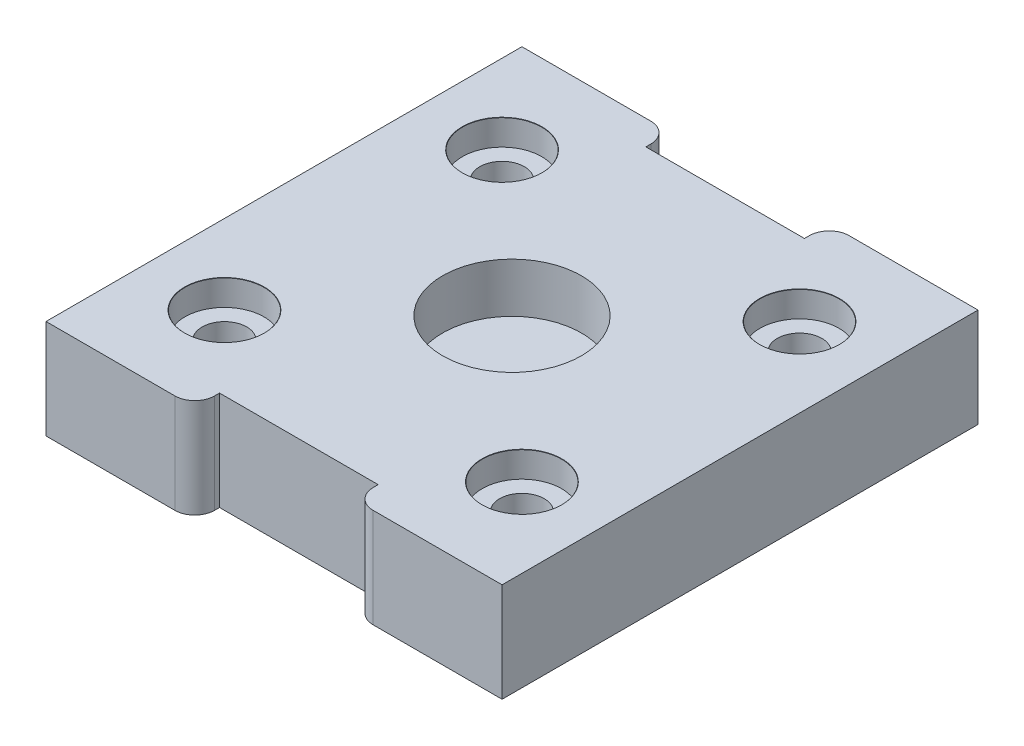
ISO-10303-21;
HEADER;
FILE_DESCRIPTION(('STEP AP214'),'2;1');
FILE_NAME('part.step','',(''),(''),'','','');
FILE_SCHEMA(('AUTOMOTIVE_DESIGN { 1 0 10303 214 1 1 1 1 }'));
ENDSEC;
DATA;
#1=APPLICATION_CONTEXT('core data for automotive mechanical design processes');
#2=APPLICATION_PROTOCOL_DEFINITION('international standard','automotive_design',2000,#1);
#3=PRODUCT_CONTEXT('',#1,'mechanical');
#4=PRODUCT('Part','Part','',(#3));
#5=PRODUCT_RELATED_PRODUCT_CATEGORY('part','',(#4));
#6=PRODUCT_DEFINITION_FORMATION('','',#4);
#7=PRODUCT_DEFINITION_CONTEXT('part definition',#1,'design');
#8=PRODUCT_DEFINITION('design','',#6,#7);
#9=PRODUCT_DEFINITION_SHAPE('','',#8);
#10=(LENGTH_UNIT() NAMED_UNIT(*) SI_UNIT(.MILLI.,.METRE.));
#11=(NAMED_UNIT(*) PLANE_ANGLE_UNIT() SI_UNIT($,.RADIAN.));
#12=(NAMED_UNIT(*) SI_UNIT($,.STERADIAN.) SOLID_ANGLE_UNIT());
#13=UNCERTAINTY_MEASURE_WITH_UNIT(LENGTH_MEASURE(1.E-05),#10,'distance_accuracy_value','');
#14=(GEOMETRIC_REPRESENTATION_CONTEXT(3) GLOBAL_UNCERTAINTY_ASSIGNED_CONTEXT((#13)) GLOBAL_UNIT_ASSIGNED_CONTEXT((#10,
#11,#12)) REPRESENTATION_CONTEXT('',''));
#15=CARTESIAN_POINT('',(0.,0.,0.));
#16=DIRECTION('',(0.,0.,1.));
#17=DIRECTION('',(1.,0.,0.));
#18=AXIS2_PLACEMENT_3D('',#15,#16,#17);
#19=CARTESIAN_POINT('',(0.,0.,48.));
#20=DIRECTION('',(0.,0.,1.));
#21=DIRECTION('',(1.,0.,0.));
#22=AXIS2_PLACEMENT_3D('',#19,#20,#21);
#23=PLANE('',#22);
#24=DIRECTION('',(1.,0.,0.));
#25=VECTOR('',#24,1.);
#26=CARTESIAN_POINT('',(-23.,-5.,48.));
#27=LINE('',#26,#25);
#28=CARTESIAN_POINT('',(-23.,-5.,48.));
#29=VERTEX_POINT('',#28);
#30=CARTESIAN_POINT('',(-10.,-5.,48.));
#31=VERTEX_POINT('',#30);
#32=EDGE_CURVE('E209',#29,#31,#27,.T.);
#33=ORIENTED_EDGE('',*,*,#32,.T.);
#34=DIRECTION('',(0.,-1.,0.));
#35=VECTOR('',#34,1.);
#36=CARTESIAN_POINT('',(-10.,5.,48.));
#37=LINE('',#36,#35);
#38=CARTESIAN_POINT('',(-10.,5.,48.));
#39=VERTEX_POINT('',#38);
#40=EDGE_CURVE('E257',#31,#39,#37,.F.);
#41=ORIENTED_EDGE('',*,*,#40,.T.);
#42=DIRECTION('',(-1.,0.,0.));
#43=VECTOR('',#42,1.);
#44=CARTESIAN_POINT('',(-23.,5.,48.));
#45=LINE('',#44,#43);
#46=CARTESIAN_POINT('',(-23.,5.,48.));
#47=VERTEX_POINT('',#46);
#48=EDGE_CURVE('E201',#39,#47,#45,.T.);
#49=ORIENTED_EDGE('',*,*,#48,.T.);
#50=DIRECTION('',(0.,-1.,0.));
#51=VECTOR('',#50,1.);
#52=CARTESIAN_POINT('',(-23.,5.,48.));
#53=LINE('',#52,#51);
#54=EDGE_CURVE('E206',#47,#29,#53,.T.);
#55=ORIENTED_EDGE('',*,*,#54,.T.);
#56=EDGE_LOOP('',(#33,#41,#49,#55));
#57=FACE_BOUND('',#56,.T.);
#58=ADVANCED_FACE('F33',(#57),#23,.T.);
#59=CARTESIAN_POINT('',(0.,0.,0.));
#60=DIRECTION('',(0.,0.,1.));
#61=DIRECTION('',(1.,0.,0.));
#62=AXIS2_PLACEMENT_3D('',#59,#60,#61);
#63=PLANE('',#62);
#64=DIRECTION('',(1.,0.,0.));
#65=VECTOR('',#64,1.);
#66=CARTESIAN_POINT('',(-23.,-5.,0.));
#67=LINE('',#66,#65);
#68=CARTESIAN_POINT('',(10.,-5.,0.));
#69=VERTEX_POINT('',#68);
#70=CARTESIAN_POINT('',(23.,-5.,0.));
#71=VERTEX_POINT('',#70);
#72=EDGE_CURVE('E221',#69,#71,#67,.T.);
#73=ORIENTED_EDGE('',*,*,#72,.F.);
#74=DIRECTION('',(0.,1.,0.));
#75=VECTOR('',#74,1.);
#76=CARTESIAN_POINT('',(10.,0.,0.));
#77=LINE('',#76,#75);
#78=CARTESIAN_POINT('',(10.,5.,0.));
#79=VERTEX_POINT('',#78);
#80=EDGE_CURVE('E259',#69,#79,#77,.T.);
#81=ORIENTED_EDGE('',*,*,#80,.T.);
#82=DIRECTION('',(-1.,0.,0.));
#83=VECTOR('',#82,1.);
#84=CARTESIAN_POINT('',(-23.,5.,0.));
#85=LINE('',#84,#83);
#86=CARTESIAN_POINT('',(23.,5.,0.));
#87=VERTEX_POINT('',#86);
#88=EDGE_CURVE('E216',#87,#79,#85,.T.);
#89=ORIENTED_EDGE('',*,*,#88,.F.);
#90=DIRECTION('',(0.,1.,0.));
#91=VECTOR('',#90,1.);
#92=CARTESIAN_POINT('',(23.,5.,0.));
#93=LINE('',#92,#91);
#94=EDGE_CURVE('E175',#71,#87,#93,.T.);
#95=ORIENTED_EDGE('',*,*,#94,.F.);
#96=EDGE_LOOP('',(#73,#81,#89,#95));
#97=FACE_BOUND('',#96,.T.);
#98=ADVANCED_FACE('F293',(#97),#63,.F.);
#99=CARTESIAN_POINT('',(23.,5.,48.));
#100=DIRECTION('',(-1.,0.,0.));
#101=DIRECTION('',(0.,0.,1.));
#102=AXIS2_PLACEMENT_3D('',#99,#100,#101);
#103=PLANE('',#102);
#104=ORIENTED_EDGE('',*,*,#94,.T.);
#105=DIRECTION('',(0.,0.,-1.));
#106=VECTOR('',#105,1.);
#107=CARTESIAN_POINT('',(23.,5.,48.));
#108=LINE('',#107,#106);
#109=CARTESIAN_POINT('',(23.,5.,48.));
#110=VERTEX_POINT('',#109);
#111=EDGE_CURVE('E231',#110,#87,#108,.T.);
#112=ORIENTED_EDGE('',*,*,#111,.F.);
#113=DIRECTION('',(0.,1.,0.));
#114=VECTOR('',#113,1.);
#115=CARTESIAN_POINT('',(23.,5.,48.));
#116=LINE('',#115,#114);
#117=CARTESIAN_POINT('',(23.,-5.,48.));
#118=VERTEX_POINT('',#117);
#119=EDGE_CURVE('E198',#118,#110,#116,.T.);
#120=ORIENTED_EDGE('',*,*,#119,.F.);
#121=DIRECTION('',(0.,0.,-1.));
#122=VECTOR('',#121,1.);
#123=CARTESIAN_POINT('',(23.,-5.,48.));
#124=LINE('',#123,#122);
#125=EDGE_CURVE('E212',#118,#71,#124,.T.);
#126=ORIENTED_EDGE('',*,*,#125,.T.);
#127=EDGE_LOOP('',(#104,#112,#120,#126));
#128=FACE_BOUND('',#127,.T.);
#129=ADVANCED_FACE('F300',(#128),#103,.F.);
#130=CARTESIAN_POINT('',(-23.,5.,48.));
#131=DIRECTION('',(0.,-1.,0.));
#132=DIRECTION('',(0.,0.,-1.));
#133=AXIS2_PLACEMENT_3D('',#130,#131,#132);
#134=PLANE('',#133);
#135=CARTESIAN_POINT('',(0.,5.,24.));
#136=DIRECTION('',(0.,1.,0.));
#137=DIRECTION('',(0.,0.,1.));
#138=AXIS2_PLACEMENT_3D('',#135,#136,#137);
#139=CIRCLE('',#138,7.);
#140=CARTESIAN_POINT('',(0.,5.,31.));
#141=VERTEX_POINT('',#140);
#142=EDGE_CURVE('E703',#141,#141,#139,.T.);
#143=ORIENTED_EDGE('',*,*,#142,.F.);
#144=EDGE_LOOP('',(#143));
#145=FACE_BOUND('',#144,.T.);
#146=CARTESIAN_POINT('',(-15.,5.,10.));
#147=DIRECTION('',(0.,1.,0.));
#148=DIRECTION('',(0.,0.,1.));
#149=AXIS2_PLACEMENT_3D('',#146,#147,#148);
#150=CIRCLE('',#149,4.025);
#151=CARTESIAN_POINT('',(-15.,5.,14.025));
#152=VERTEX_POINT('',#151);
#153=EDGE_CURVE('E699',#152,#152,#150,.T.);
#154=ORIENTED_EDGE('',*,*,#153,.F.);
#155=EDGE_LOOP('',(#154));
#156=FACE_BOUND('',#155,.T.);
#157=CARTESIAN_POINT('',(-15.,5.,38.));
#158=DIRECTION('',(0.,1.,0.));
#159=DIRECTION('',(0.,0.,1.));
#160=AXIS2_PLACEMENT_3D('',#157,#158,#159);
#161=CIRCLE('',#160,4.025);
#162=CARTESIAN_POINT('',(-15.,5.,42.025));
#163=VERTEX_POINT('',#162);
#164=EDGE_CURVE('E684',#163,#163,#161,.T.);
#165=ORIENTED_EDGE('',*,*,#164,.F.);
#166=EDGE_LOOP('',(#165));
#167=FACE_BOUND('',#166,.T.);
#168=CARTESIAN_POINT('',(15.,5.,38.));
#169=DIRECTION('',(0.,1.,0.));
#170=DIRECTION('',(0.,0.,1.));
#171=AXIS2_PLACEMENT_3D('',#168,#169,#170);
#172=CIRCLE('',#171,4.025);
#173=CARTESIAN_POINT('',(15.,5.,42.025));
#174=VERTEX_POINT('',#173);
#175=EDGE_CURVE('E669',#174,#174,#172,.T.);
#176=ORIENTED_EDGE('',*,*,#175,.F.);
#177=EDGE_LOOP('',(#176));
#178=FACE_BOUND('',#177,.T.);
#179=CARTESIAN_POINT('',(15.,5.,10.));
#180=DIRECTION('',(0.,1.,0.));
#181=DIRECTION('',(0.,0.,1.));
#182=AXIS2_PLACEMENT_3D('',#179,#180,#181);
#183=CIRCLE('',#182,4.025);
#184=CARTESIAN_POINT('',(15.,5.,14.025));
#185=VERTEX_POINT('',#184);
#186=EDGE_CURVE('E654',#185,#185,#183,.T.);
#187=ORIENTED_EDGE('',*,*,#186,.F.);
#188=EDGE_LOOP('',(#187));
#189=FACE_BOUND('',#188,.T.);
#190=DIRECTION('',(0.,0.,-1.));
#191=VECTOR('',#190,1.);
#192=CARTESIAN_POINT('',(7.99999999999998,5.,50.5));
#193=LINE('',#192,#191);
#194=CARTESIAN_POINT('',(7.99999999999998,5.,46.));
#195=VERTEX_POINT('',#194);
#196=CARTESIAN_POINT('',(7.99999999999998,5.,45.5));
#197=VERTEX_POINT('',#196);
#198=EDGE_CURVE('E190',#195,#197,#193,.T.);
#199=ORIENTED_EDGE('',*,*,#198,.F.);
#200=CARTESIAN_POINT('',(9.99999999999998,5.,46.));
#201=DIRECTION('',(0.,-1.,0.));
#202=DIRECTION('',(0.,0.,-1.));
#203=AXIS2_PLACEMENT_3D('',#200,#201,#202);
#204=CIRCLE('',#203,2.);
#205=CARTESIAN_POINT('',(9.99999999999998,5.,48.));
#206=VERTEX_POINT('',#205);
#207=EDGE_CURVE('E243',#195,#206,#204,.F.);
#208=ORIENTED_EDGE('',*,*,#207,.T.);
#209=EDGE_CURVE('E203',#110,#206,#45,.T.);
#210=ORIENTED_EDGE('',*,*,#209,.F.);
#211=ORIENTED_EDGE('',*,*,#111,.T.);
#212=ORIENTED_EDGE('',*,*,#88,.T.);
#213=CARTESIAN_POINT('',(10.,5.,2.));
#214=DIRECTION('',(0.,-1.,0.));
#215=DIRECTION('',(0.,0.,-1.));
#216=AXIS2_PLACEMENT_3D('',#213,#214,#215);
#217=CIRCLE('',#216,2.);
#218=CARTESIAN_POINT('',(8.,5.,2.));
#219=VERTEX_POINT('',#218);
#220=EDGE_CURVE('E239',#79,#219,#217,.F.);
#221=ORIENTED_EDGE('',*,*,#220,.T.);
#222=DIRECTION('',(0.,0.,-1.));
#223=VECTOR('',#222,1.);
#224=CARTESIAN_POINT('',(8.,5.,-2.5));
#225=LINE('',#224,#223);
#226=CARTESIAN_POINT('',(8.,5.,2.5));
#227=VERTEX_POINT('',#226);
#228=EDGE_CURVE('E168',#227,#219,#225,.T.);
#229=ORIENTED_EDGE('',*,*,#228,.F.);
#230=DIRECTION('',(1.,0.,0.));
#231=VECTOR('',#230,1.);
#232=CARTESIAN_POINT('',(-8.,5.,2.5));
#233=LINE('',#232,#231);
#234=CARTESIAN_POINT('',(-8.,5.,2.5));
#235=VERTEX_POINT('',#234);
#236=EDGE_CURVE('E173',#235,#227,#233,.T.);
#237=ORIENTED_EDGE('',*,*,#236,.F.);
#238=DIRECTION('',(0.,0.,1.));
#239=VECTOR('',#238,1.);
#240=CARTESIAN_POINT('',(-8.,5.,-2.5));
#241=LINE('',#240,#239);
#242=CARTESIAN_POINT('',(-8.,5.,2.));
#243=VERTEX_POINT('',#242);
#244=EDGE_CURVE('E157',#243,#235,#241,.T.);
#245=ORIENTED_EDGE('',*,*,#244,.F.);
#246=CARTESIAN_POINT('',(-10.,5.,2.));
#247=DIRECTION('',(0.,-1.,0.));
#248=DIRECTION('',(0.,0.,-1.));
#249=AXIS2_PLACEMENT_3D('',#246,#247,#248);
#250=CIRCLE('',#249,2.);
#251=CARTESIAN_POINT('',(-10.,5.,0.));
#252=VERTEX_POINT('',#251);
#253=EDGE_CURVE('E237',#243,#252,#250,.F.);
#254=ORIENTED_EDGE('',*,*,#253,.T.);
#255=CARTESIAN_POINT('',(-23.,5.,0.));
#256=VERTEX_POINT('',#255);
#257=EDGE_CURVE('E215',#252,#256,#85,.T.);
#258=ORIENTED_EDGE('',*,*,#257,.T.);
#259=DIRECTION('',(0.,0.,-1.));
#260=VECTOR('',#259,1.);
#261=CARTESIAN_POINT('',(-23.,5.,48.));
#262=LINE('',#261,#260);
#263=EDGE_CURVE('E228',#47,#256,#262,.T.);
#264=ORIENTED_EDGE('',*,*,#263,.F.);
#265=ORIENTED_EDGE('',*,*,#48,.F.);
#266=CARTESIAN_POINT('',(-10.,5.,46.));
#267=DIRECTION('',(0.,-1.,0.));
#268=DIRECTION('',(0.,0.,-1.));
#269=AXIS2_PLACEMENT_3D('',#266,#267,#268);
#270=CIRCLE('',#269,2.);
#271=CARTESIAN_POINT('',(-8.00000000000001,5.,46.));
#272=VERTEX_POINT('',#271);
#273=EDGE_CURVE('E241',#39,#272,#270,.F.);
#274=ORIENTED_EDGE('',*,*,#273,.T.);
#275=DIRECTION('',(0.,0.,1.));
#276=VECTOR('',#275,1.);
#277=CARTESIAN_POINT('',(-8.00000000000001,5.,50.5));
#278=LINE('',#277,#276);
#279=CARTESIAN_POINT('',(-8.00000000000001,5.,45.5));
#280=VERTEX_POINT('',#279);
#281=EDGE_CURVE('E187',#280,#272,#278,.T.);
#282=ORIENTED_EDGE('',*,*,#281,.F.);
#283=DIRECTION('',(-1.,0.,0.));
#284=VECTOR('',#283,1.);
#285=CARTESIAN_POINT('',(-8.00000000000001,5.,45.5));
#286=LINE('',#285,#284);
#287=EDGE_CURVE('E181',#197,#280,#286,.T.);
#288=ORIENTED_EDGE('',*,*,#287,.F.);
#289=EDGE_LOOP('',(#199,#208,#210,#211,#212,#221,#229,#237,#245,#254,#258,#264,#265,#274,#282,#288));
#290=FACE_BOUND('',#289,.T.);
#291=ADVANCED_FACE('F278',(#145,#156,#167,#178,#189,#290),#134,.F.);
#292=CARTESIAN_POINT('',(-23.,5.,48.));
#293=DIRECTION('',(1.,0.,0.));
#294=DIRECTION('',(0.,0.,-1.));
#295=AXIS2_PLACEMENT_3D('',#292,#293,#294);
#296=PLANE('',#295);
#297=DIRECTION('',(0.,-1.,0.));
#298=VECTOR('',#297,1.);
#299=CARTESIAN_POINT('',(-23.,5.,0.));
#300=LINE('',#299,#298);
#301=CARTESIAN_POINT('',(-23.,-5.,0.));
#302=VERTEX_POINT('',#301);
#303=EDGE_CURVE('E219',#256,#302,#300,.T.);
#304=ORIENTED_EDGE('',*,*,#303,.T.);
#305=DIRECTION('',(0.,0.,-1.));
#306=VECTOR('',#305,1.);
#307=CARTESIAN_POINT('',(-23.,-5.,48.));
#308=LINE('',#307,#306);
#309=EDGE_CURVE('E225',#29,#302,#308,.T.);
#310=ORIENTED_EDGE('',*,*,#309,.F.);
#311=ORIENTED_EDGE('',*,*,#54,.F.);
#312=ORIENTED_EDGE('',*,*,#263,.T.);
#313=EDGE_LOOP('',(#304,#310,#311,#312));
#314=FACE_BOUND('',#313,.T.);
#315=ADVANCED_FACE('F273',(#314),#296,.F.);
#316=CARTESIAN_POINT('',(-23.,-5.,48.));
#317=DIRECTION('',(0.,1.,0.));
#318=DIRECTION('',(0.,0.,1.));
#319=AXIS2_PLACEMENT_3D('',#316,#317,#318);
#320=PLANE('',#319);
#321=CARTESIAN_POINT('',(-15.,-5.,10.));
#322=DIRECTION('',(0.,1.,0.));
#323=DIRECTION('',(0.,0.,1.));
#324=AXIS2_PLACEMENT_3D('',#321,#322,#323);
#325=CIRCLE('',#324,2.25);
#326=CARTESIAN_POINT('',(-15.,-5.,12.25));
#327=VERTEX_POINT('',#326);
#328=EDGE_CURVE('E687',#327,#327,#325,.T.);
#329=ORIENTED_EDGE('',*,*,#328,.T.);
#330=EDGE_LOOP('',(#329));
#331=FACE_BOUND('',#330,.T.);
#332=CARTESIAN_POINT('',(-15.,-5.,38.));
#333=DIRECTION('',(0.,1.,0.));
#334=DIRECTION('',(0.,0.,1.));
#335=AXIS2_PLACEMENT_3D('',#332,#333,#334);
#336=CIRCLE('',#335,2.25);
#337=CARTESIAN_POINT('',(-15.,-5.,40.25));
#338=VERTEX_POINT('',#337);
#339=EDGE_CURVE('E672',#338,#338,#336,.T.);
#340=ORIENTED_EDGE('',*,*,#339,.T.);
#341=EDGE_LOOP('',(#340));
#342=FACE_BOUND('',#341,.T.);
#343=CARTESIAN_POINT('',(15.,-5.,38.));
#344=DIRECTION('',(0.,1.,0.));
#345=DIRECTION('',(0.,0.,1.));
#346=AXIS2_PLACEMENT_3D('',#343,#344,#345);
#347=CIRCLE('',#346,2.25);
#348=CARTESIAN_POINT('',(15.,-5.,40.25));
#349=VERTEX_POINT('',#348);
#350=EDGE_CURVE('E657',#349,#349,#347,.T.);
#351=ORIENTED_EDGE('',*,*,#350,.T.);
#352=EDGE_LOOP('',(#351));
#353=FACE_BOUND('',#352,.T.);
#354=CARTESIAN_POINT('',(15.,-5.,10.));
#355=DIRECTION('',(0.,1.,0.));
#356=DIRECTION('',(0.,0.,1.));
#357=AXIS2_PLACEMENT_3D('',#354,#355,#356);
#358=CIRCLE('',#357,2.25);
#359=CARTESIAN_POINT('',(15.,-5.,12.25));
#360=VERTEX_POINT('',#359);
#361=EDGE_CURVE('E191',#360,#360,#358,.T.);
#362=ORIENTED_EDGE('',*,*,#361,.T.);
#363=EDGE_LOOP('',(#362));
#364=FACE_BOUND('',#363,.T.);
#365=CARTESIAN_POINT('',(9.99999999999998,-5.,48.));
#366=VERTEX_POINT('',#365);
#367=EDGE_CURVE('E208',#366,#118,#27,.T.);
#368=ORIENTED_EDGE('',*,*,#367,.F.);
#369=CARTESIAN_POINT('',(9.99999999999998,-5.,46.));
#370=DIRECTION('',(0.,1.,0.));
#371=DIRECTION('',(0.,0.,1.));
#372=AXIS2_PLACEMENT_3D('',#369,#370,#371);
#373=CIRCLE('',#372,2.);
#374=CARTESIAN_POINT('',(7.99999999999998,-5.,46.));
#375=VERTEX_POINT('',#374);
#376=EDGE_CURVE('E252',#366,#375,#373,.F.);
#377=ORIENTED_EDGE('',*,*,#376,.T.);
#378=DIRECTION('',(0.,0.,-1.));
#379=VECTOR('',#378,1.);
#380=CARTESIAN_POINT('',(7.99999999999998,-5.,50.5));
#381=LINE('',#380,#379);
#382=CARTESIAN_POINT('',(7.99999999999998,-5.,45.5));
#383=VERTEX_POINT('',#382);
#384=EDGE_CURVE('E180',#375,#383,#381,.T.);
#385=ORIENTED_EDGE('',*,*,#384,.T.);
#386=DIRECTION('',(-1.,0.,0.));
#387=VECTOR('',#386,1.);
#388=CARTESIAN_POINT('',(-8.00000000000001,-5.,45.5));
#389=LINE('',#388,#387);
#390=CARTESIAN_POINT('',(-8.00000000000001,-5.,45.5));
#391=VERTEX_POINT('',#390);
#392=EDGE_CURVE('E183',#383,#391,#389,.T.);
#393=ORIENTED_EDGE('',*,*,#392,.T.);
#394=DIRECTION('',(0.,0.,1.));
#395=VECTOR('',#394,1.);
#396=CARTESIAN_POINT('',(-8.00000000000001,-5.,50.5));
#397=LINE('',#396,#395);
#398=CARTESIAN_POINT('',(-8.00000000000001,-5.,46.));
#399=VERTEX_POINT('',#398);
#400=EDGE_CURVE('E177',#391,#399,#397,.T.);
#401=ORIENTED_EDGE('',*,*,#400,.T.);
#402=CARTESIAN_POINT('',(-10.,-5.,46.));
#403=DIRECTION('',(0.,1.,0.));
#404=DIRECTION('',(0.,0.,1.));
#405=AXIS2_PLACEMENT_3D('',#402,#403,#404);
#406=CIRCLE('',#405,2.);
#407=EDGE_CURVE('E250',#399,#31,#406,.F.);
#408=ORIENTED_EDGE('',*,*,#407,.T.);
#409=ORIENTED_EDGE('',*,*,#32,.F.);
#410=ORIENTED_EDGE('',*,*,#309,.T.);
#411=CARTESIAN_POINT('',(-10.,-5.,0.));
#412=VERTEX_POINT('',#411);
#413=EDGE_CURVE('E202',#302,#412,#67,.T.);
#414=ORIENTED_EDGE('',*,*,#413,.T.);
#415=CARTESIAN_POINT('',(-10.,-5.,2.));
#416=DIRECTION('',(0.,1.,0.));
#417=DIRECTION('',(0.,0.,1.));
#418=AXIS2_PLACEMENT_3D('',#415,#416,#417);
#419=CIRCLE('',#418,2.);
#420=CARTESIAN_POINT('',(-8.,-5.,2.));
#421=VERTEX_POINT('',#420);
#422=EDGE_CURVE('E48',#412,#421,#419,.F.);
#423=ORIENTED_EDGE('',*,*,#422,.T.);
#424=DIRECTION('',(0.,0.,1.));
#425=VECTOR('',#424,1.);
#426=CARTESIAN_POINT('',(-8.,-5.,-2.5));
#427=LINE('',#426,#425);
#428=CARTESIAN_POINT('',(-8.,-5.,2.5));
#429=VERTEX_POINT('',#428);
#430=EDGE_CURVE('E143',#421,#429,#427,.T.);
#431=ORIENTED_EDGE('',*,*,#430,.T.);
#432=DIRECTION('',(1.,0.,0.));
#433=VECTOR('',#432,1.);
#434=CARTESIAN_POINT('',(-8.,-5.,2.5));
#435=LINE('',#434,#433);
#436=CARTESIAN_POINT('',(8.,-5.,2.5));
#437=VERTEX_POINT('',#436);
#438=EDGE_CURVE('E149',#429,#437,#435,.T.);
#439=ORIENTED_EDGE('',*,*,#438,.T.);
#440=DIRECTION('',(0.,0.,-1.));
#441=VECTOR('',#440,1.);
#442=CARTESIAN_POINT('',(8.,-5.,-2.5));
#443=LINE('',#442,#441);
#444=CARTESIAN_POINT('',(8.,-5.,2.));
#445=VERTEX_POINT('',#444);
#446=EDGE_CURVE('E151',#437,#445,#443,.T.);
#447=ORIENTED_EDGE('',*,*,#446,.T.);
#448=CARTESIAN_POINT('',(10.,-5.,2.));
#449=DIRECTION('',(0.,1.,0.));
#450=DIRECTION('',(0.,0.,1.));
#451=AXIS2_PLACEMENT_3D('',#448,#449,#450);
#452=CIRCLE('',#451,2.);
#453=EDGE_CURVE('E248',#445,#69,#452,.F.);
#454=ORIENTED_EDGE('',*,*,#453,.T.);
#455=ORIENTED_EDGE('',*,*,#72,.T.);
#456=ORIENTED_EDGE('',*,*,#125,.F.);
#457=EDGE_LOOP('',(#368,#377,#385,#393,#401,#408,#409,#410,#414,#423,#431,#439,#447,#454,#455,#456));
#458=FACE_BOUND('',#457,.T.);
#459=ADVANCED_FACE('F146',(#331,#342,#353,#364,#458),#320,.F.);
#460=ORIENTED_EDGE('',*,*,#209,.T.);
#461=DIRECTION('',(0.,1.,0.));
#462=VECTOR('',#461,1.);
#463=CARTESIAN_POINT('',(9.99999999999998,-5.,48.));
#464=LINE('',#463,#462);
#465=EDGE_CURVE('E245',#206,#366,#464,.F.);
#466=ORIENTED_EDGE('',*,*,#465,.T.);
#467=ORIENTED_EDGE('',*,*,#367,.T.);
#468=ORIENTED_EDGE('',*,*,#119,.T.);
#469=EDGE_LOOP('',(#460,#466,#467,#468));
#470=FACE_BOUND('',#469,.T.);
#471=ADVANCED_FACE('F296',(#470),#23,.T.);
#472=ORIENTED_EDGE('',*,*,#257,.F.);
#473=DIRECTION('',(0.,-1.,0.));
#474=VECTOR('',#473,1.);
#475=CARTESIAN_POINT('',(-10.,0.,0.));
#476=LINE('',#475,#474);
#477=EDGE_CURVE('E41',#252,#412,#476,.T.);
#478=ORIENTED_EDGE('',*,*,#477,.T.);
#479=ORIENTED_EDGE('',*,*,#413,.F.);
#480=ORIENTED_EDGE('',*,*,#303,.F.);
#481=EDGE_LOOP('',(#472,#478,#479,#480));
#482=FACE_BOUND('',#481,.T.);
#483=ADVANCED_FACE('F266',(#482),#63,.F.);
#484=CARTESIAN_POINT('',(8.,-5.,-2.5));
#485=DIRECTION('',(1.,0.,0.));
#486=DIRECTION('',(0.,0.,-1.));
#487=AXIS2_PLACEMENT_3D('',#484,#485,#486);
#488=PLANE('',#487);
#489=ORIENTED_EDGE('',*,*,#228,.T.);
#490=DIRECTION('',(0.,1.,0.));
#491=VECTOR('',#490,1.);
#492=CARTESIAN_POINT('',(8.,-5.,2.));
#493=LINE('',#492,#491);
#494=EDGE_CURVE('E262',#219,#445,#493,.F.);
#495=ORIENTED_EDGE('',*,*,#494,.T.);
#496=ORIENTED_EDGE('',*,*,#446,.F.);
#497=DIRECTION('',(0.,1.,0.));
#498=VECTOR('',#497,1.);
#499=CARTESIAN_POINT('',(8.,-5.,2.5));
#500=LINE('',#499,#498);
#501=EDGE_CURVE('E161',#437,#227,#500,.T.);
#502=ORIENTED_EDGE('',*,*,#501,.T.);
#503=EDGE_LOOP('',(#489,#495,#496,#502));
#504=FACE_BOUND('',#503,.T.);
#505=ADVANCED_FACE('F310',(#504),#488,.F.);
#506=CARTESIAN_POINT('',(-8.,-5.,-2.5));
#507=DIRECTION('',(-1.,0.,0.));
#508=DIRECTION('',(0.,0.,1.));
#509=AXIS2_PLACEMENT_3D('',#506,#507,#508);
#510=PLANE('',#509);
#511=ORIENTED_EDGE('',*,*,#430,.F.);
#512=DIRECTION('',(0.,-1.,0.));
#513=VECTOR('',#512,1.);
#514=CARTESIAN_POINT('',(-8.,-5.,2.));
#515=LINE('',#514,#513);
#516=EDGE_CURVE('E11',#421,#243,#515,.F.);
#517=ORIENTED_EDGE('',*,*,#516,.T.);
#518=ORIENTED_EDGE('',*,*,#244,.T.);
#519=DIRECTION('',(0.,1.,0.));
#520=VECTOR('',#519,1.);
#521=CARTESIAN_POINT('',(-8.,-5.,2.5));
#522=LINE('',#521,#520);
#523=EDGE_CURVE('E154',#429,#235,#522,.T.);
#524=ORIENTED_EDGE('',*,*,#523,.F.);
#525=EDGE_LOOP('',(#511,#517,#518,#524));
#526=FACE_BOUND('',#525,.T.);
#527=ADVANCED_FACE('F155',(#526),#510,.F.);
#528=CARTESIAN_POINT('',(-8.,-5.,2.5));
#529=DIRECTION('',(0.,0.,1.));
#530=DIRECTION('',(1.,0.,0.));
#531=AXIS2_PLACEMENT_3D('',#528,#529,#530);
#532=PLANE('',#531);
#533=ORIENTED_EDGE('',*,*,#236,.T.);
#534=ORIENTED_EDGE('',*,*,#501,.F.);
#535=ORIENTED_EDGE('',*,*,#438,.F.);
#536=ORIENTED_EDGE('',*,*,#523,.T.);
#537=EDGE_LOOP('',(#533,#534,#535,#536));
#538=FACE_BOUND('',#537,.T.);
#539=ADVANCED_FACE('F163',(#538),#532,.F.);
#540=CARTESIAN_POINT('',(-8.00000000000001,-5.,50.5));
#541=DIRECTION('',(-1.,0.,0.));
#542=DIRECTION('',(0.,0.,1.));
#543=AXIS2_PLACEMENT_3D('',#540,#541,#542);
#544=PLANE('',#543);
#545=ORIENTED_EDGE('',*,*,#281,.T.);
#546=DIRECTION('',(0.,-1.,0.));
#547=VECTOR('',#546,1.);
#548=CARTESIAN_POINT('',(-8.00000000000001,-5.,46.));
#549=LINE('',#548,#547);
#550=EDGE_CURVE('E254',#272,#399,#549,.T.);
#551=ORIENTED_EDGE('',*,*,#550,.T.);
#552=ORIENTED_EDGE('',*,*,#400,.F.);
#553=DIRECTION('',(0.,1.,0.));
#554=VECTOR('',#553,1.);
#555=CARTESIAN_POINT('',(-8.00000000000001,-5.,45.5));
#556=LINE('',#555,#554);
#557=EDGE_CURVE('E171',#391,#280,#556,.T.);
#558=ORIENTED_EDGE('',*,*,#557,.T.);
#559=EDGE_LOOP('',(#545,#551,#552,#558));
#560=FACE_BOUND('',#559,.T.);
#561=ADVANCED_FACE('F331',(#560),#544,.F.);
#562=CARTESIAN_POINT('',(-8.00000000000001,-5.,45.5));
#563=DIRECTION('',(0.,0.,-1.));
#564=DIRECTION('',(-1.,0.,0.));
#565=AXIS2_PLACEMENT_3D('',#562,#563,#564);
#566=PLANE('',#565);
#567=ORIENTED_EDGE('',*,*,#287,.T.);
#568=ORIENTED_EDGE('',*,*,#557,.F.);
#569=ORIENTED_EDGE('',*,*,#392,.F.);
#570=DIRECTION('',(0.,1.,0.));
#571=VECTOR('',#570,1.);
#572=CARTESIAN_POINT('',(7.99999999999998,-5.,45.5));
#573=LINE('',#572,#571);
#574=EDGE_CURVE('E186',#383,#197,#573,.T.);
#575=ORIENTED_EDGE('',*,*,#574,.T.);
#576=EDGE_LOOP('',(#567,#568,#569,#575));
#577=FACE_BOUND('',#576,.T.);
#578=ADVANCED_FACE('F328',(#577),#566,.F.);
#579=CARTESIAN_POINT('',(7.99999999999998,-5.,50.5));
#580=DIRECTION('',(1.,0.,0.));
#581=DIRECTION('',(0.,0.,-1.));
#582=AXIS2_PLACEMENT_3D('',#579,#580,#581);
#583=PLANE('',#582);
#584=ORIENTED_EDGE('',*,*,#384,.F.);
#585=DIRECTION('',(0.,1.,0.));
#586=VECTOR('',#585,1.);
#587=CARTESIAN_POINT('',(7.99999999999998,5.,46.));
#588=LINE('',#587,#586);
#589=EDGE_CURVE('E234',#375,#195,#588,.T.);
#590=ORIENTED_EDGE('',*,*,#589,.T.);
#591=ORIENTED_EDGE('',*,*,#198,.T.);
#592=ORIENTED_EDGE('',*,*,#574,.F.);
#593=EDGE_LOOP('',(#584,#590,#591,#592));
#594=FACE_BOUND('',#593,.T.);
#595=ADVANCED_FACE('F324',(#594),#583,.F.);
#596=CARTESIAN_POINT('',(9.99999999999998,-5.,46.));
#597=DIRECTION('',(0.,-1.,0.));
#598=DIRECTION('',(0.,0.,-1.));
#599=AXIS2_PLACEMENT_3D('',#596,#597,#598);
#600=CYLINDRICAL_SURFACE('',#599,2.);
#601=ORIENTED_EDGE('',*,*,#376,.F.);
#602=ORIENTED_EDGE('',*,*,#465,.F.);
#603=ORIENTED_EDGE('',*,*,#207,.F.);
#604=ORIENTED_EDGE('',*,*,#589,.F.);
#605=EDGE_LOOP('',(#601,#602,#603,#604));
#606=FACE_BOUND('',#605,.T.);
#607=ADVANCED_FACE('F318',(#606),#600,.T.);
#608=CARTESIAN_POINT('',(-10.,-5.,46.));
#609=DIRECTION('',(0.,1.,0.));
#610=DIRECTION('',(0.,0.,1.));
#611=AXIS2_PLACEMENT_3D('',#608,#609,#610);
#612=CYLINDRICAL_SURFACE('',#611,2.);
#613=ORIENTED_EDGE('',*,*,#273,.F.);
#614=ORIENTED_EDGE('',*,*,#40,.F.);
#615=ORIENTED_EDGE('',*,*,#407,.F.);
#616=ORIENTED_EDGE('',*,*,#550,.F.);
#617=EDGE_LOOP('',(#613,#614,#615,#616));
#618=FACE_BOUND('',#617,.T.);
#619=ADVANCED_FACE('F290',(#618),#612,.T.);
#620=CARTESIAN_POINT('',(10.,0.,2.));
#621=DIRECTION('',(0.,1.,0.));
#622=DIRECTION('',(0.,0.,1.));
#623=AXIS2_PLACEMENT_3D('',#620,#621,#622);
#624=CYLINDRICAL_SURFACE('',#623,2.);
#625=ORIENTED_EDGE('',*,*,#453,.F.);
#626=ORIENTED_EDGE('',*,*,#494,.F.);
#627=ORIENTED_EDGE('',*,*,#220,.F.);
#628=ORIENTED_EDGE('',*,*,#80,.F.);
#629=EDGE_LOOP('',(#625,#626,#627,#628));
#630=FACE_BOUND('',#629,.T.);
#631=ADVANCED_FACE('F282',(#630),#624,.T.);
#632=CARTESIAN_POINT('',(-10.,0.,2.));
#633=DIRECTION('',(0.,-1.,0.));
#634=DIRECTION('',(0.,0.,-1.));
#635=AXIS2_PLACEMENT_3D('',#632,#633,#634);
#636=CYLINDRICAL_SURFACE('',#635,2.);
#637=ORIENTED_EDGE('',*,*,#253,.F.);
#638=ORIENTED_EDGE('',*,*,#516,.F.);
#639=ORIENTED_EDGE('',*,*,#422,.F.);
#640=ORIENTED_EDGE('',*,*,#477,.F.);
#641=EDGE_LOOP('',(#637,#638,#639,#640));
#642=FACE_BOUND('',#641,.T.);
#643=ADVANCED_FACE('F35',(#642),#636,.T.);
#644=CARTESIAN_POINT('',(15.,5.,10.));
#645=DIRECTION('',(0.,1.,0.));
#646=DIRECTION('',(0.,0.,1.));
#647=AXIS2_PLACEMENT_3D('',#644,#645,#646);
#648=CYLINDRICAL_SURFACE('',#647,2.25);
#649=ORIENTED_EDGE('',*,*,#361,.F.);
#650=EDGE_LOOP('',(#649));
#651=FACE_BOUND('',#650,.T.);
#652=CARTESIAN_POINT('',(15.,2.4,10.));
#653=DIRECTION('',(0.,1.,0.));
#654=DIRECTION('',(0.,0.,1.));
#655=AXIS2_PLACEMENT_3D('',#652,#653,#654);
#656=CIRCLE('',#655,2.25);
#657=CARTESIAN_POINT('',(15.,2.4,12.25));
#658=VERTEX_POINT('',#657);
#659=EDGE_CURVE('E645',#658,#658,#656,.T.);
#660=ORIENTED_EDGE('',*,*,#659,.T.);
#661=EDGE_LOOP('',(#660));
#662=FACE_BOUND('',#661,.T.);
#663=ADVANCED_FACE('F281',(#651,#662),#648,.F.);
#664=CARTESIAN_POINT('',(17.25,2.4,10.));
#665=DIRECTION('',(0.,-1.,0.));
#666=DIRECTION('',(0.,0.,-1.));
#667=AXIS2_PLACEMENT_3D('',#664,#665,#666);
#668=PLANE('',#667);
#669=ORIENTED_EDGE('',*,*,#659,.F.);
#670=EDGE_LOOP('',(#669));
#671=FACE_BOUND('',#670,.T.);
#672=CARTESIAN_POINT('',(15.,2.4,10.));
#673=DIRECTION('',(0.,1.,0.));
#674=DIRECTION('',(0.,0.,1.));
#675=AXIS2_PLACEMENT_3D('',#672,#673,#674);
#676=CIRCLE('',#675,4.);
#677=CARTESIAN_POINT('',(15.,2.4,14.));
#678=VERTEX_POINT('',#677);
#679=EDGE_CURVE('E648',#678,#678,#676,.T.);
#680=ORIENTED_EDGE('',*,*,#679,.T.);
#681=EDGE_LOOP('',(#680));
#682=FACE_BOUND('',#681,.T.);
#683=ADVANCED_FACE('F287',(#671,#682),#668,.F.);
#684=CARTESIAN_POINT('',(15.,5.,10.));
#685=DIRECTION('',(0.,1.,0.));
#686=DIRECTION('',(0.,0.,1.));
#687=AXIS2_PLACEMENT_3D('',#684,#685,#686);
#688=CYLINDRICAL_SURFACE('',#687,4.);
#689=ORIENTED_EDGE('',*,*,#679,.F.);
#690=EDGE_LOOP('',(#689));
#691=FACE_BOUND('',#690,.T.);
#692=CARTESIAN_POINT('',(15.,4.975,10.));
#693=DIRECTION('',(0.,1.,0.));
#694=DIRECTION('',(0.,0.,1.));
#695=AXIS2_PLACEMENT_3D('',#692,#693,#694);
#696=CIRCLE('',#695,4.);
#697=CARTESIAN_POINT('',(15.,4.975,14.));
#698=VERTEX_POINT('',#697);
#699=EDGE_CURVE('E651',#698,#698,#696,.T.);
#700=ORIENTED_EDGE('',*,*,#699,.T.);
#701=EDGE_LOOP('',(#700));
#702=FACE_BOUND('',#701,.T.);
#703=ADVANCED_FACE('F379',(#691,#702),#688,.F.);
#704=CARTESIAN_POINT('',(15.,5.,10.));
#705=DIRECTION('',(0.,1.,0.));
#706=DIRECTION('',(0.,0.,1.));
#707=AXIS2_PLACEMENT_3D('',#704,#705,#706);
#708=CONICAL_SURFACE('',#707,4.025,0.785398163397466);
#709=ORIENTED_EDGE('',*,*,#699,.F.);
#710=EDGE_LOOP('',(#709));
#711=FACE_BOUND('',#710,.T.);
#712=ORIENTED_EDGE('',*,*,#186,.T.);
#713=EDGE_LOOP('',(#712));
#714=FACE_BOUND('',#713,.T.);
#715=ADVANCED_FACE('F389',(#711,#714),#708,.F.);
#716=CARTESIAN_POINT('',(15.,5.,38.));
#717=DIRECTION('',(0.,1.,0.));
#718=DIRECTION('',(0.,0.,1.));
#719=AXIS2_PLACEMENT_3D('',#716,#717,#718);
#720=CYLINDRICAL_SURFACE('',#719,2.25);
#721=ORIENTED_EDGE('',*,*,#350,.F.);
#722=EDGE_LOOP('',(#721));
#723=FACE_BOUND('',#722,.T.);
#724=CARTESIAN_POINT('',(15.,2.4,38.));
#725=DIRECTION('',(0.,1.,0.));
#726=DIRECTION('',(0.,0.,1.));
#727=AXIS2_PLACEMENT_3D('',#724,#725,#726);
#728=CIRCLE('',#727,2.25);
#729=CARTESIAN_POINT('',(15.,2.4,40.25));
#730=VERTEX_POINT('',#729);
#731=EDGE_CURVE('E660',#730,#730,#728,.T.);
#732=ORIENTED_EDGE('',*,*,#731,.T.);
#733=EDGE_LOOP('',(#732));
#734=FACE_BOUND('',#733,.T.);
#735=ADVANCED_FACE('F399',(#723,#734),#720,.F.);
#736=CARTESIAN_POINT('',(17.25,2.4,38.));
#737=DIRECTION('',(0.,-1.,0.));
#738=DIRECTION('',(0.,0.,-1.));
#739=AXIS2_PLACEMENT_3D('',#736,#737,#738);
#740=PLANE('',#739);
#741=ORIENTED_EDGE('',*,*,#731,.F.);
#742=EDGE_LOOP('',(#741));
#743=FACE_BOUND('',#742,.T.);
#744=CARTESIAN_POINT('',(15.,2.4,38.));
#745=DIRECTION('',(0.,1.,0.));
#746=DIRECTION('',(0.,0.,1.));
#747=AXIS2_PLACEMENT_3D('',#744,#745,#746);
#748=CIRCLE('',#747,4.);
#749=CARTESIAN_POINT('',(15.,2.4,42.));
#750=VERTEX_POINT('',#749);
#751=EDGE_CURVE('E663',#750,#750,#748,.T.);
#752=ORIENTED_EDGE('',*,*,#751,.T.);
#753=EDGE_LOOP('',(#752));
#754=FACE_BOUND('',#753,.T.);
#755=ADVANCED_FACE('F409',(#743,#754),#740,.F.);
#756=CARTESIAN_POINT('',(15.,5.,38.));
#757=DIRECTION('',(0.,1.,0.));
#758=DIRECTION('',(0.,0.,1.));
#759=AXIS2_PLACEMENT_3D('',#756,#757,#758);
#760=CYLINDRICAL_SURFACE('',#759,4.);
#761=ORIENTED_EDGE('',*,*,#751,.F.);
#762=EDGE_LOOP('',(#761));
#763=FACE_BOUND('',#762,.T.);
#764=CARTESIAN_POINT('',(15.,4.975,38.));
#765=DIRECTION('',(0.,1.,0.));
#766=DIRECTION('',(0.,0.,1.));
#767=AXIS2_PLACEMENT_3D('',#764,#765,#766);
#768=CIRCLE('',#767,4.);
#769=CARTESIAN_POINT('',(15.,4.975,42.));
#770=VERTEX_POINT('',#769);
#771=EDGE_CURVE('E666',#770,#770,#768,.T.);
#772=ORIENTED_EDGE('',*,*,#771,.T.);
#773=EDGE_LOOP('',(#772));
#774=FACE_BOUND('',#773,.T.);
#775=ADVANCED_FACE('F419',(#763,#774),#760,.F.);
#776=CARTESIAN_POINT('',(15.,5.,38.));
#777=DIRECTION('',(0.,1.,0.));
#778=DIRECTION('',(0.,0.,1.));
#779=AXIS2_PLACEMENT_3D('',#776,#777,#778);
#780=CONICAL_SURFACE('',#779,4.025,0.785398163397466);
#781=ORIENTED_EDGE('',*,*,#771,.F.);
#782=EDGE_LOOP('',(#781));
#783=FACE_BOUND('',#782,.T.);
#784=ORIENTED_EDGE('',*,*,#175,.T.);
#785=EDGE_LOOP('',(#784));
#786=FACE_BOUND('',#785,.T.);
#787=ADVANCED_FACE('F429',(#783,#786),#780,.F.);
#788=CARTESIAN_POINT('',(-15.,5.,38.));
#789=DIRECTION('',(0.,1.,0.));
#790=DIRECTION('',(0.,0.,1.));
#791=AXIS2_PLACEMENT_3D('',#788,#789,#790);
#792=CYLINDRICAL_SURFACE('',#791,2.25);
#793=ORIENTED_EDGE('',*,*,#339,.F.);
#794=EDGE_LOOP('',(#793));
#795=FACE_BOUND('',#794,.T.);
#796=CARTESIAN_POINT('',(-15.,2.4,38.));
#797=DIRECTION('',(0.,1.,0.));
#798=DIRECTION('',(0.,0.,1.));
#799=AXIS2_PLACEMENT_3D('',#796,#797,#798);
#800=CIRCLE('',#799,2.25);
#801=CARTESIAN_POINT('',(-15.,2.4,40.25));
#802=VERTEX_POINT('',#801);
#803=EDGE_CURVE('E675',#802,#802,#800,.T.);
#804=ORIENTED_EDGE('',*,*,#803,.T.);
#805=EDGE_LOOP('',(#804));
#806=FACE_BOUND('',#805,.T.);
#807=ADVANCED_FACE('F439',(#795,#806),#792,.F.);
#808=CARTESIAN_POINT('',(-12.75,2.4,38.));
#809=DIRECTION('',(0.,-1.,0.));
#810=DIRECTION('',(0.,0.,-1.));
#811=AXIS2_PLACEMENT_3D('',#808,#809,#810);
#812=PLANE('',#811);
#813=ORIENTED_EDGE('',*,*,#803,.F.);
#814=EDGE_LOOP('',(#813));
#815=FACE_BOUND('',#814,.T.);
#816=CARTESIAN_POINT('',(-15.,2.4,38.));
#817=DIRECTION('',(0.,1.,0.));
#818=DIRECTION('',(0.,0.,1.));
#819=AXIS2_PLACEMENT_3D('',#816,#817,#818);
#820=CIRCLE('',#819,4.);
#821=CARTESIAN_POINT('',(-15.,2.4,42.));
#822=VERTEX_POINT('',#821);
#823=EDGE_CURVE('E678',#822,#822,#820,.T.);
#824=ORIENTED_EDGE('',*,*,#823,.T.);
#825=EDGE_LOOP('',(#824));
#826=FACE_BOUND('',#825,.T.);
#827=ADVANCED_FACE('F449',(#815,#826),#812,.F.);
#828=CARTESIAN_POINT('',(-15.,5.,38.));
#829=DIRECTION('',(0.,1.,0.));
#830=DIRECTION('',(0.,0.,1.));
#831=AXIS2_PLACEMENT_3D('',#828,#829,#830);
#832=CYLINDRICAL_SURFACE('',#831,4.);
#833=ORIENTED_EDGE('',*,*,#823,.F.);
#834=EDGE_LOOP('',(#833));
#835=FACE_BOUND('',#834,.T.);
#836=CARTESIAN_POINT('',(-15.,4.975,38.));
#837=DIRECTION('',(0.,1.,0.));
#838=DIRECTION('',(0.,0.,1.));
#839=AXIS2_PLACEMENT_3D('',#836,#837,#838);
#840=CIRCLE('',#839,4.);
#841=CARTESIAN_POINT('',(-15.,4.975,42.));
#842=VERTEX_POINT('',#841);
#843=EDGE_CURVE('E681',#842,#842,#840,.T.);
#844=ORIENTED_EDGE('',*,*,#843,.T.);
#845=EDGE_LOOP('',(#844));
#846=FACE_BOUND('',#845,.T.);
#847=ADVANCED_FACE('F459',(#835,#846),#832,.F.);
#848=CARTESIAN_POINT('',(-15.,5.,38.));
#849=DIRECTION('',(0.,1.,0.));
#850=DIRECTION('',(0.,0.,1.));
#851=AXIS2_PLACEMENT_3D('',#848,#849,#850);
#852=CONICAL_SURFACE('',#851,4.025,0.785398163397431);
#853=ORIENTED_EDGE('',*,*,#843,.F.);
#854=EDGE_LOOP('',(#853));
#855=FACE_BOUND('',#854,.T.);
#856=ORIENTED_EDGE('',*,*,#164,.T.);
#857=EDGE_LOOP('',(#856));
#858=FACE_BOUND('',#857,.T.);
#859=ADVANCED_FACE('F469',(#855,#858),#852,.F.);
#860=CARTESIAN_POINT('',(-15.,5.,10.));
#861=DIRECTION('',(0.,1.,0.));
#862=DIRECTION('',(0.,0.,1.));
#863=AXIS2_PLACEMENT_3D('',#860,#861,#862);
#864=CYLINDRICAL_SURFACE('',#863,2.25);
#865=ORIENTED_EDGE('',*,*,#328,.F.);
#866=EDGE_LOOP('',(#865));
#867=FACE_BOUND('',#866,.T.);
#868=CARTESIAN_POINT('',(-15.,2.4,10.));
#869=DIRECTION('',(0.,1.,0.));
#870=DIRECTION('',(0.,0.,1.));
#871=AXIS2_PLACEMENT_3D('',#868,#869,#870);
#872=CIRCLE('',#871,2.25);
#873=CARTESIAN_POINT('',(-15.,2.4,12.25));
#874=VERTEX_POINT('',#873);
#875=EDGE_CURVE('E690',#874,#874,#872,.T.);
#876=ORIENTED_EDGE('',*,*,#875,.T.);
#877=EDGE_LOOP('',(#876));
#878=FACE_BOUND('',#877,.T.);
#879=ADVANCED_FACE('F479',(#867,#878),#864,.F.);
#880=CARTESIAN_POINT('',(-12.75,2.4,10.));
#881=DIRECTION('',(0.,-1.,0.));
#882=DIRECTION('',(0.,0.,-1.));
#883=AXIS2_PLACEMENT_3D('',#880,#881,#882);
#884=PLANE('',#883);
#885=ORIENTED_EDGE('',*,*,#875,.F.);
#886=EDGE_LOOP('',(#885));
#887=FACE_BOUND('',#886,.T.);
#888=CARTESIAN_POINT('',(-15.,2.4,10.));
#889=DIRECTION('',(0.,1.,0.));
#890=DIRECTION('',(0.,0.,1.));
#891=AXIS2_PLACEMENT_3D('',#888,#889,#890);
#892=CIRCLE('',#891,4.);
#893=CARTESIAN_POINT('',(-15.,2.4,14.));
#894=VERTEX_POINT('',#893);
#895=EDGE_CURVE('E693',#894,#894,#892,.T.);
#896=ORIENTED_EDGE('',*,*,#895,.T.);
#897=EDGE_LOOP('',(#896));
#898=FACE_BOUND('',#897,.T.);
#899=ADVANCED_FACE('F489',(#887,#898),#884,.F.);
#900=CARTESIAN_POINT('',(-15.,5.,10.));
#901=DIRECTION('',(0.,1.,0.));
#902=DIRECTION('',(0.,0.,1.));
#903=AXIS2_PLACEMENT_3D('',#900,#901,#902);
#904=CYLINDRICAL_SURFACE('',#903,4.);
#905=ORIENTED_EDGE('',*,*,#895,.F.);
#906=EDGE_LOOP('',(#905));
#907=FACE_BOUND('',#906,.T.);
#908=CARTESIAN_POINT('',(-15.,4.975,10.));
#909=DIRECTION('',(0.,1.,0.));
#910=DIRECTION('',(0.,0.,1.));
#911=AXIS2_PLACEMENT_3D('',#908,#909,#910);
#912=CIRCLE('',#911,4.);
#913=CARTESIAN_POINT('',(-15.,4.975,14.));
#914=VERTEX_POINT('',#913);
#915=EDGE_CURVE('E696',#914,#914,#912,.T.);
#916=ORIENTED_EDGE('',*,*,#915,.T.);
#917=EDGE_LOOP('',(#916));
#918=FACE_BOUND('',#917,.T.);
#919=ADVANCED_FACE('F499',(#907,#918),#904,.F.);
#920=CARTESIAN_POINT('',(-15.,5.,10.));
#921=DIRECTION('',(0.,1.,0.));
#922=DIRECTION('',(0.,0.,1.));
#923=AXIS2_PLACEMENT_3D('',#920,#921,#922);
#924=CONICAL_SURFACE('',#923,4.025,0.785398163397431);
#925=ORIENTED_EDGE('',*,*,#915,.F.);
#926=EDGE_LOOP('',(#925));
#927=FACE_BOUND('',#926,.T.);
#928=ORIENTED_EDGE('',*,*,#153,.T.);
#929=EDGE_LOOP('',(#928));
#930=FACE_BOUND('',#929,.T.);
#931=ADVANCED_FACE('F509',(#927,#930),#924,.F.);
#932=CARTESIAN_POINT('',(0.,0.,24.));
#933=DIRECTION('',(0.,1.,0.));
#934=DIRECTION('',(0.,0.,1.));
#935=AXIS2_PLACEMENT_3D('',#932,#933,#934);
#936=CYLINDRICAL_SURFACE('',#935,7.);
#937=CARTESIAN_POINT('',(0.,0.,24.));
#938=DIRECTION('',(0.,1.,0.));
#939=DIRECTION('',(0.,0.,1.));
#940=AXIS2_PLACEMENT_3D('',#937,#938,#939);
#941=CIRCLE('',#940,7.);
#942=CARTESIAN_POINT('',(0.,0.,31.));
#943=VERTEX_POINT('',#942);
#944=EDGE_CURVE('E702',#943,#943,#941,.T.);
#945=ORIENTED_EDGE('',*,*,#944,.F.);
#946=EDGE_LOOP('',(#945));
#947=FACE_BOUND('',#946,.T.);
#948=ORIENTED_EDGE('',*,*,#142,.T.);
#949=EDGE_LOOP('',(#948));
#950=FACE_BOUND('',#949,.T.);
#951=ADVANCED_FACE('F518',(#947,#950),#936,.F.);
#952=CARTESIAN_POINT('',(0.,0.,24.));
#953=DIRECTION('',(0.,1.,0.));
#954=DIRECTION('',(0.,0.,1.));
#955=AXIS2_PLACEMENT_3D('',#952,#953,#954);
#956=PLANE('',#955);
#957=ORIENTED_EDGE('',*,*,#944,.T.);
#958=EDGE_LOOP('',(#957));
#959=FACE_BOUND('',#958,.T.);
#960=ADVANCED_FACE('F534',(#959),#956,.T.);
#961=CLOSED_SHELL('',(#58,#98,#129,#291,#315,#459,#471,#483,#505,#527,#539,#561,#578,#595,#607,
#619,#631,#643,#663,#683,#703,#715,#735,#755,#775,#787,#807,#827,#847,#859,#879,#899,#919,#931,
#951,#960));
#962=MANIFOLD_SOLID_BREP('B2',#961);
#963=ADVANCED_BREP_SHAPE_REPRESENTATION('',(#18,#962),#14);
#964=SHAPE_DEFINITION_REPRESENTATION(#9,#963);
ENDSEC;
END-ISO-10303-21;
